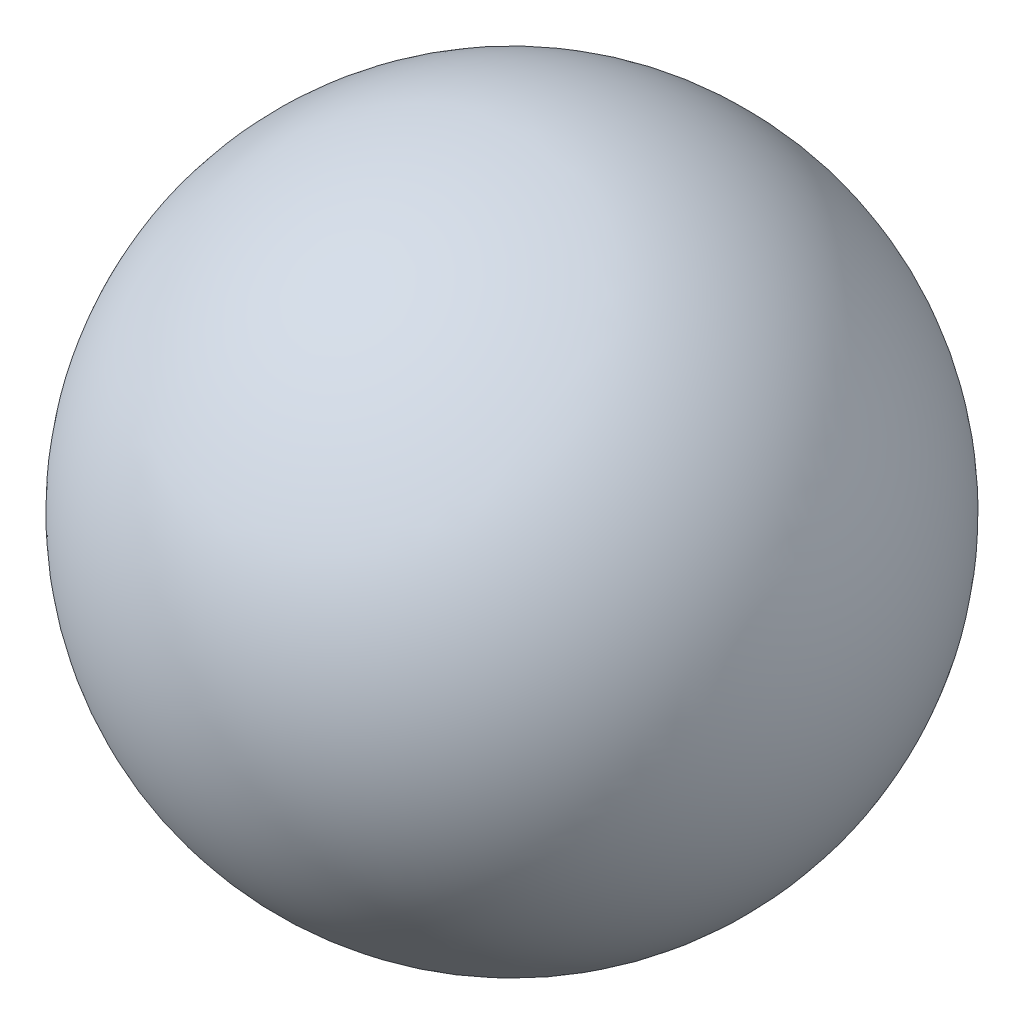
ISO-10303-21;
HEADER;
FILE_DESCRIPTION(('STEP AP214'),'2;1');
FILE_NAME('part.step','',(''),(''),'','','');
FILE_SCHEMA(('AUTOMOTIVE_DESIGN { 1 0 10303 214 1 1 1 1 }'));
ENDSEC;
DATA;
#1=APPLICATION_CONTEXT('core data for automotive mechanical design processes');
#2=APPLICATION_PROTOCOL_DEFINITION('international standard','automotive_design',2000,#1);
#3=PRODUCT_CONTEXT('',#1,'mechanical');
#4=PRODUCT('Part','Part','',(#3));
#5=PRODUCT_RELATED_PRODUCT_CATEGORY('part','',(#4));
#6=PRODUCT_DEFINITION_FORMATION('','',#4);
#7=PRODUCT_DEFINITION_CONTEXT('part definition',#1,'design');
#8=PRODUCT_DEFINITION('design','',#6,#7);
#9=PRODUCT_DEFINITION_SHAPE('','',#8);
#10=(LENGTH_UNIT() NAMED_UNIT(*) SI_UNIT(.MILLI.,.METRE.));
#11=(NAMED_UNIT(*) PLANE_ANGLE_UNIT() SI_UNIT($,.RADIAN.));
#12=(NAMED_UNIT(*) SI_UNIT($,.STERADIAN.) SOLID_ANGLE_UNIT());
#13=UNCERTAINTY_MEASURE_WITH_UNIT(LENGTH_MEASURE(1.E-05),#10,'distance_accuracy_value','');
#14=(GEOMETRIC_REPRESENTATION_CONTEXT(3) GLOBAL_UNCERTAINTY_ASSIGNED_CONTEXT((#13)) GLOBAL_UNIT_ASSIGNED_CONTEXT((#10,
#11,#12)) REPRESENTATION_CONTEXT('',''));
#15=CARTESIAN_POINT('',(0.,0.,0.));
#16=DIRECTION('',(0.,0.,1.));
#17=DIRECTION('',(1.,0.,0.));
#18=AXIS2_PLACEMENT_3D('',#15,#16,#17);
#19=CARTESIAN_POINT('',(0.,0.,0.));
#20=DIRECTION('',(-1.,0.,0.));
#21=DIRECTION('',(0.,1.,0.));
#22=AXIS2_PLACEMENT_3D('',#19,#20,#21);
#23=SPHERICAL_SURFACE('',#22,3.5);
#24=CARTESIAN_POINT('',(-3.5,0.,0.));
#25=VERTEX_POINT('',#24);
#26=VERTEX_LOOP('',#25);
#27=FACE_BOUND('',#26,.T.);
#28=ADVANCED_FACE('F28',(#27),#23,.T.);
#29=CLOSED_SHELL('',(#28));
#30=MANIFOLD_SOLID_BREP('B2',#29);
#31=ADVANCED_BREP_SHAPE_REPRESENTATION('',(#18,#30),#14);
#32=SHAPE_DEFINITION_REPRESENTATION(#9,#31);
ENDSEC;
END-ISO-10303-21;
